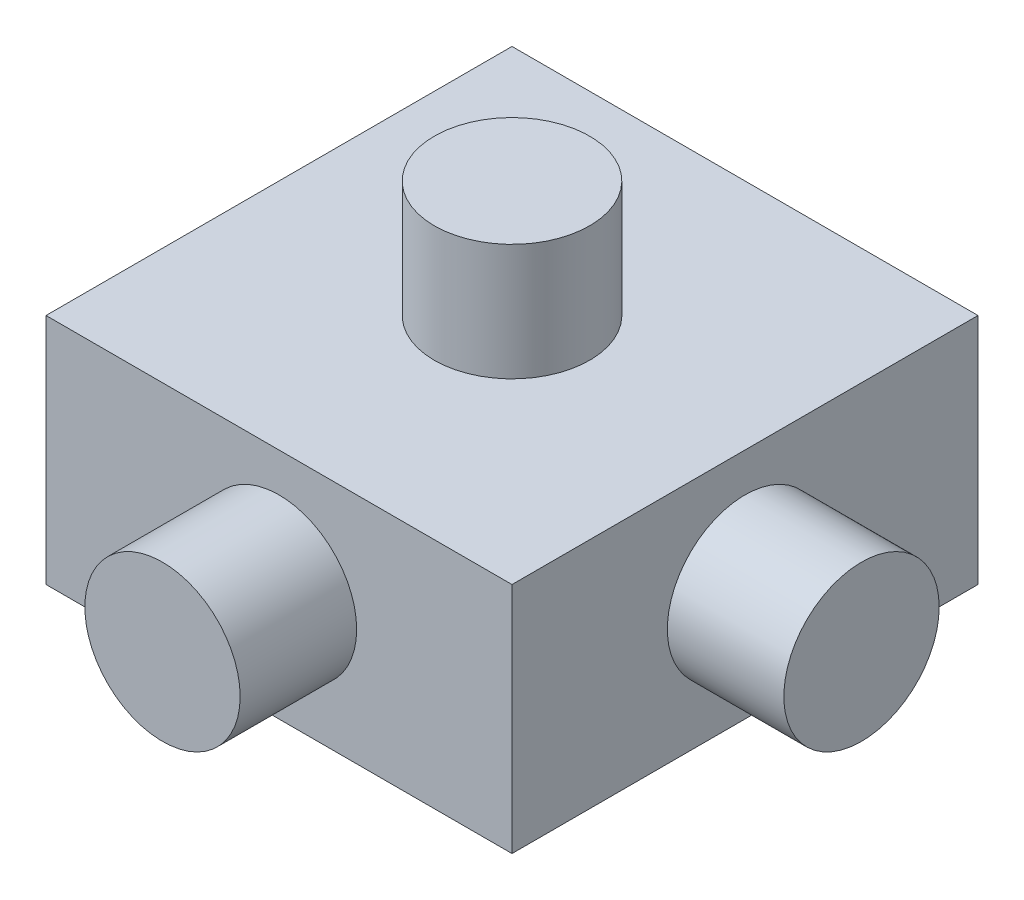
ISO-10303-21;
HEADER;
FILE_DESCRIPTION(('STEP AP214'),'2;1');
FILE_NAME('part.step','',(''),(''),'','','');
FILE_SCHEMA(('AUTOMOTIVE_DESIGN { 1 0 10303 214 1 1 1 1 }'));
ENDSEC;
DATA;
#1=APPLICATION_CONTEXT('core data for automotive mechanical design processes');
#2=APPLICATION_PROTOCOL_DEFINITION('international standard','automotive_design',2000,#1);
#3=PRODUCT_CONTEXT('',#1,'mechanical');
#4=PRODUCT('Part','Part','',(#3));
#5=PRODUCT_RELATED_PRODUCT_CATEGORY('part','',(#4));
#6=PRODUCT_DEFINITION_FORMATION('','',#4);
#7=PRODUCT_DEFINITION_CONTEXT('part definition',#1,'design');
#8=PRODUCT_DEFINITION('design','',#6,#7);
#9=PRODUCT_DEFINITION_SHAPE('','',#8);
#10=(LENGTH_UNIT() NAMED_UNIT(*) SI_UNIT(.MILLI.,.METRE.));
#11=(NAMED_UNIT(*) PLANE_ANGLE_UNIT() SI_UNIT($,.RADIAN.));
#12=(NAMED_UNIT(*) SI_UNIT($,.STERADIAN.) SOLID_ANGLE_UNIT());
#13=UNCERTAINTY_MEASURE_WITH_UNIT(LENGTH_MEASURE(1.E-05),#10,'distance_accuracy_value','');
#14=(GEOMETRIC_REPRESENTATION_CONTEXT(3) GLOBAL_UNCERTAINTY_ASSIGNED_CONTEXT((#13)) GLOBAL_UNIT_ASSIGNED_CONTEXT((#10,
#11,#12)) REPRESENTATION_CONTEXT('',''));
#15=CARTESIAN_POINT('',(0.,0.,0.));
#16=DIRECTION('',(0.,0.,1.));
#17=DIRECTION('',(1.,0.,0.));
#18=AXIS2_PLACEMENT_3D('',#15,#16,#17);
#19=CARTESIAN_POINT('',(-42.687876758205,30.,27.3673811118553));
#20=DIRECTION('',(1.,0.,0.));
#21=DIRECTION('',(0.,0.,-1.));
#22=AXIS2_PLACEMENT_3D('',#19,#20,#21);
#23=PLANE('',#22);
#24=DIRECTION('',(0.,0.,1.));
#25=VECTOR('',#24,1.);
#26=CARTESIAN_POINT('',(-42.687876758205,0.,27.3673811118553));
#27=LINE('',#26,#25);
#28=CARTESIAN_POINT('',(-42.687876758205,0.,-32.6326188881447));
#29=VERTEX_POINT('',#28);
#30=CARTESIAN_POINT('',(-42.687876758205,0.,27.3673811118553));
#31=VERTEX_POINT('',#30);
#32=EDGE_CURVE('E100',#29,#31,#27,.T.);
#33=ORIENTED_EDGE('',*,*,#32,.T.);
#34=DIRECTION('',(0.,-1.,0.));
#35=VECTOR('',#34,1.);
#36=CARTESIAN_POINT('',(-42.687876758205,30.,27.3673811118553));
#37=LINE('',#36,#35);
#38=CARTESIAN_POINT('',(-42.687876758205,30.,27.3673811118553));
#39=VERTEX_POINT('',#38);
#40=EDGE_CURVE('E36',#39,#31,#37,.T.);
#41=ORIENTED_EDGE('',*,*,#40,.F.);
#42=DIRECTION('',(0.,0.,1.));
#43=VECTOR('',#42,1.);
#44=CARTESIAN_POINT('',(-42.687876758205,30.,27.3673811118553));
#45=LINE('',#44,#43);
#46=CARTESIAN_POINT('',(-42.687876758205,30.,-32.6326188881447));
#47=VERTEX_POINT('',#46);
#48=EDGE_CURVE('E87',#47,#39,#45,.T.);
#49=ORIENTED_EDGE('',*,*,#48,.F.);
#50=DIRECTION('',(0.,-1.,0.));
#51=VECTOR('',#50,1.);
#52=CARTESIAN_POINT('',(-42.687876758205,30.,-32.6326188881447));
#53=LINE('',#52,#51);
#54=EDGE_CURVE('E96',#47,#29,#53,.T.);
#55=ORIENTED_EDGE('',*,*,#54,.T.);
#56=EDGE_LOOP('',(#33,#41,#49,#55));
#57=FACE_BOUND('',#56,.T.);
#58=ADVANCED_FACE('F33',(#57),#23,.F.);
#59=CARTESIAN_POINT('',(-42.687876758205,30.,27.3673811118553));
#60=DIRECTION('',(0.,0.,-1.));
#61=DIRECTION('',(-1.,0.,0.));
#62=AXIS2_PLACEMENT_3D('',#59,#60,#61);
#63=PLANE('',#62);
#64=CARTESIAN_POINT('',(-12.687876758205,15.,27.3673811118553));
#65=DIRECTION('',(0.,0.,1.));
#66=DIRECTION('',(1.,0.,0.));
#67=AXIS2_PLACEMENT_3D('',#64,#65,#66);
#68=CIRCLE('',#67,10.);
#69=CARTESIAN_POINT('',(-2.68787675820496,15.,27.3673811118553));
#70=VERTEX_POINT('',#69);
#71=EDGE_CURVE('E42',#70,#70,#68,.T.);
#72=ORIENTED_EDGE('',*,*,#71,.F.);
#73=EDGE_LOOP('',(#72));
#74=FACE_BOUND('',#73,.T.);
#75=DIRECTION('',(1.,0.,0.));
#76=VECTOR('',#75,1.);
#77=CARTESIAN_POINT('',(-42.687876758205,0.,27.3673811118553));
#78=LINE('',#77,#76);
#79=CARTESIAN_POINT('',(17.312123241795,0.,27.3673811118553));
#80=VERTEX_POINT('',#79);
#81=EDGE_CURVE('E92',#31,#80,#78,.T.);
#82=ORIENTED_EDGE('',*,*,#81,.T.);
#83=DIRECTION('',(0.,-1.,0.));
#84=VECTOR('',#83,1.);
#85=CARTESIAN_POINT('',(17.312123241795,30.,27.3673811118553));
#86=LINE('',#85,#84);
#87=CARTESIAN_POINT('',(17.312123241795,30.,27.3673811118553));
#88=VERTEX_POINT('',#87);
#89=EDGE_CURVE('E90',#88,#80,#86,.T.);
#90=ORIENTED_EDGE('',*,*,#89,.F.);
#91=DIRECTION('',(1.,0.,0.));
#92=VECTOR('',#91,1.);
#93=CARTESIAN_POINT('',(-42.687876758205,30.,27.3673811118553));
#94=LINE('',#93,#92);
#95=EDGE_CURVE('E82',#39,#88,#94,.T.);
#96=ORIENTED_EDGE('',*,*,#95,.F.);
#97=ORIENTED_EDGE('',*,*,#40,.T.);
#98=EDGE_LOOP('',(#82,#90,#96,#97));
#99=FACE_BOUND('',#98,.T.);
#100=ADVANCED_FACE('F91',(#74,#99),#63,.F.);
#101=CARTESIAN_POINT('',(17.312123241795,30.,27.3673811118553));
#102=DIRECTION('',(-1.,0.,0.));
#103=DIRECTION('',(0.,0.,1.));
#104=AXIS2_PLACEMENT_3D('',#101,#102,#103);
#105=PLANE('',#104);
#106=CARTESIAN_POINT('',(17.312123241795,15.,-2.63261888814467));
#107=DIRECTION('',(1.,0.,0.));
#108=DIRECTION('',(0.,0.,-1.));
#109=AXIS2_PLACEMENT_3D('',#106,#107,#108);
#110=CIRCLE('',#109,10.);
#111=CARTESIAN_POINT('',(17.312123241795,15.,-12.6326188881447));
#112=VERTEX_POINT('',#111);
#113=EDGE_CURVE('E114',#112,#112,#110,.T.);
#114=ORIENTED_EDGE('',*,*,#113,.F.);
#115=EDGE_LOOP('',(#114));
#116=FACE_BOUND('',#115,.T.);
#117=DIRECTION('',(0.,0.,-1.));
#118=VECTOR('',#117,1.);
#119=CARTESIAN_POINT('',(17.312123241795,0.,27.3673811118553));
#120=LINE('',#119,#118);
#121=CARTESIAN_POINT('',(17.312123241795,0.,-32.6326188881447));
#122=VERTEX_POINT('',#121);
#123=EDGE_CURVE('E68',#80,#122,#120,.T.);
#124=ORIENTED_EDGE('',*,*,#123,.T.);
#125=DIRECTION('',(0.,-1.,0.));
#126=VECTOR('',#125,1.);
#127=CARTESIAN_POINT('',(17.312123241795,30.,-32.6326188881447));
#128=LINE('',#127,#126);
#129=CARTESIAN_POINT('',(17.312123241795,30.,-32.6326188881447));
#130=VERTEX_POINT('',#129);
#131=EDGE_CURVE('E93',#130,#122,#128,.T.);
#132=ORIENTED_EDGE('',*,*,#131,.F.);
#133=DIRECTION('',(0.,0.,-1.));
#134=VECTOR('',#133,1.);
#135=CARTESIAN_POINT('',(17.312123241795,30.,27.3673811118553));
#136=LINE('',#135,#134);
#137=EDGE_CURVE('E85',#88,#130,#136,.T.);
#138=ORIENTED_EDGE('',*,*,#137,.F.);
#139=ORIENTED_EDGE('',*,*,#89,.T.);
#140=EDGE_LOOP('',(#124,#132,#138,#139));
#141=FACE_BOUND('',#140,.T.);
#142=ADVANCED_FACE('F94',(#116,#141),#105,.F.);
#143=CARTESIAN_POINT('',(-42.687876758205,30.,-32.6326188881447));
#144=DIRECTION('',(0.,0.,1.));
#145=DIRECTION('',(1.,0.,0.));
#146=AXIS2_PLACEMENT_3D('',#143,#144,#145);
#147=PLANE('',#146);
#148=DIRECTION('',(-1.,0.,0.));
#149=VECTOR('',#148,1.);
#150=CARTESIAN_POINT('',(-42.687876758205,0.,-32.6326188881447));
#151=LINE('',#150,#149);
#152=EDGE_CURVE('E74',#122,#29,#151,.T.);
#153=ORIENTED_EDGE('',*,*,#152,.T.);
#154=ORIENTED_EDGE('',*,*,#54,.F.);
#155=DIRECTION('',(-1.,0.,0.));
#156=VECTOR('',#155,1.);
#157=CARTESIAN_POINT('',(-42.687876758205,30.,-32.6326188881447));
#158=LINE('',#157,#156);
#159=EDGE_CURVE('E51',#130,#47,#158,.T.);
#160=ORIENTED_EDGE('',*,*,#159,.F.);
#161=ORIENTED_EDGE('',*,*,#131,.T.);
#162=EDGE_LOOP('',(#153,#154,#160,#161));
#163=FACE_BOUND('',#162,.T.);
#164=ADVANCED_FACE('F108',(#163),#147,.F.);
#165=CARTESIAN_POINT('',(0.,30.,0.));
#166=DIRECTION('',(0.,-1.,0.));
#167=DIRECTION('',(0.,0.,-1.));
#168=AXIS2_PLACEMENT_3D('',#165,#166,#167);
#169=PLANE('',#168);
#170=CARTESIAN_POINT('',(-12.687876758205,30.,-2.63261888814467));
#171=DIRECTION('',(0.,1.,0.));
#172=DIRECTION('',(0.,0.,1.));
#173=AXIS2_PLACEMENT_3D('',#170,#171,#172);
#174=CIRCLE('',#173,10.);
#175=CARTESIAN_POINT('',(-12.687876758205,30.,7.36738111185533));
#176=VERTEX_POINT('',#175);
#177=EDGE_CURVE('E11',#176,#176,#174,.T.);
#178=ORIENTED_EDGE('',*,*,#177,.F.);
#179=EDGE_LOOP('',(#178));
#180=FACE_BOUND('',#179,.T.);
#181=ORIENTED_EDGE('',*,*,#48,.T.);
#182=ORIENTED_EDGE('',*,*,#95,.T.);
#183=ORIENTED_EDGE('',*,*,#137,.T.);
#184=ORIENTED_EDGE('',*,*,#159,.T.);
#185=EDGE_LOOP('',(#181,#182,#183,#184));
#186=FACE_BOUND('',#185,.T.);
#187=ADVANCED_FACE('F83',(#180,#186),#169,.F.);
#188=CARTESIAN_POINT('',(0.,0.,0.));
#189=DIRECTION('',(0.,-1.,0.));
#190=DIRECTION('',(0.,0.,-1.));
#191=AXIS2_PLACEMENT_3D('',#188,#189,#190);
#192=PLANE('',#191);
#193=ORIENTED_EDGE('',*,*,#32,.F.);
#194=ORIENTED_EDGE('',*,*,#152,.F.);
#195=ORIENTED_EDGE('',*,*,#123,.F.);
#196=ORIENTED_EDGE('',*,*,#81,.F.);
#197=EDGE_LOOP('',(#193,#194,#195,#196));
#198=FACE_BOUND('',#197,.T.);
#199=ADVANCED_FACE('F111',(#198),#192,.T.);
#200=CARTESIAN_POINT('',(32.312123241795,15.,-2.63261888814467));
#201=DIRECTION('',(-1.,0.,0.));
#202=DIRECTION('',(0.,0.,1.));
#203=AXIS2_PLACEMENT_3D('',#200,#201,#202);
#204=CYLINDRICAL_SURFACE('',#203,10.);
#205=CARTESIAN_POINT('',(32.312123241795,15.,-2.63261888814467));
#206=DIRECTION('',(1.,0.,0.));
#207=DIRECTION('',(0.,0.,-1.));
#208=AXIS2_PLACEMENT_3D('',#205,#206,#207);
#209=CIRCLE('',#208,10.);
#210=CARTESIAN_POINT('',(32.312123241795,15.,-12.6326188881447));
#211=VERTEX_POINT('',#210);
#212=EDGE_CURVE('E103',#211,#211,#209,.T.);
#213=ORIENTED_EDGE('',*,*,#212,.F.);
#214=EDGE_LOOP('',(#213));
#215=FACE_BOUND('',#214,.T.);
#216=ORIENTED_EDGE('',*,*,#113,.T.);
#217=EDGE_LOOP('',(#216));
#218=FACE_BOUND('',#217,.T.);
#219=ADVANCED_FACE('F143',(#215,#218),#204,.T.);
#220=CARTESIAN_POINT('',(32.312123241795,15.,-2.63261888814467));
#221=DIRECTION('',(1.,0.,0.));
#222=DIRECTION('',(0.,0.,-1.));
#223=AXIS2_PLACEMENT_3D('',#220,#221,#222);
#224=PLANE('',#223);
#225=ORIENTED_EDGE('',*,*,#212,.T.);
#226=EDGE_LOOP('',(#225));
#227=FACE_BOUND('',#226,.T.);
#228=ADVANCED_FACE('F161',(#227),#224,.T.);
#229=CARTESIAN_POINT('',(-12.687876758205,15.,42.3673811118553));
#230=DIRECTION('',(0.,0.,-1.));
#231=DIRECTION('',(-1.,0.,0.));
#232=AXIS2_PLACEMENT_3D('',#229,#230,#231);
#233=CYLINDRICAL_SURFACE('',#232,10.);
#234=CARTESIAN_POINT('',(-12.687876758205,15.,42.3673811118553));
#235=DIRECTION('',(0.,0.,1.));
#236=DIRECTION('',(1.,0.,0.));
#237=AXIS2_PLACEMENT_3D('',#234,#235,#236);
#238=CIRCLE('',#237,10.);
#239=CARTESIAN_POINT('',(-2.68787675820496,15.,42.3673811118553));
#240=VERTEX_POINT('',#239);
#241=EDGE_CURVE('E119',#240,#240,#238,.T.);
#242=ORIENTED_EDGE('',*,*,#241,.F.);
#243=EDGE_LOOP('',(#242));
#244=FACE_BOUND('',#243,.T.);
#245=ORIENTED_EDGE('',*,*,#71,.T.);
#246=EDGE_LOOP('',(#245));
#247=FACE_BOUND('',#246,.T.);
#248=ADVANCED_FACE('F159',(#244,#247),#233,.T.);
#249=CARTESIAN_POINT('',(-12.687876758205,15.,42.3673811118553));
#250=DIRECTION('',(0.,0.,1.));
#251=DIRECTION('',(1.,0.,0.));
#252=AXIS2_PLACEMENT_3D('',#249,#250,#251);
#253=PLANE('',#252);
#254=ORIENTED_EDGE('',*,*,#241,.T.);
#255=EDGE_LOOP('',(#254));
#256=FACE_BOUND('',#255,.T.);
#257=ADVANCED_FACE('F133',(#256),#253,.T.);
#258=CARTESIAN_POINT('',(-12.687876758205,45.,-2.63261888814467));
#259=DIRECTION('',(0.,-1.,0.));
#260=DIRECTION('',(0.,0.,-1.));
#261=AXIS2_PLACEMENT_3D('',#258,#259,#260);
#262=CYLINDRICAL_SURFACE('',#261,10.);
#263=CARTESIAN_POINT('',(-12.687876758205,45.,-2.63261888814467));
#264=DIRECTION('',(0.,1.,0.));
#265=DIRECTION('',(0.,0.,1.));
#266=AXIS2_PLACEMENT_3D('',#263,#264,#265);
#267=CIRCLE('',#266,10.);
#268=CARTESIAN_POINT('',(-12.687876758205,45.,7.36738111185533));
#269=VERTEX_POINT('',#268);
#270=EDGE_CURVE('E123',#269,#269,#267,.T.);
#271=ORIENTED_EDGE('',*,*,#270,.F.);
#272=EDGE_LOOP('',(#271));
#273=FACE_BOUND('',#272,.T.);
#274=ORIENTED_EDGE('',*,*,#177,.T.);
#275=EDGE_LOOP('',(#274));
#276=FACE_BOUND('',#275,.T.);
#277=ADVANCED_FACE('F130',(#273,#276),#262,.T.);
#278=CARTESIAN_POINT('',(-12.687876758205,45.,-2.63261888814467));
#279=DIRECTION('',(0.,1.,0.));
#280=DIRECTION('',(0.,0.,1.));
#281=AXIS2_PLACEMENT_3D('',#278,#279,#280);
#282=PLANE('',#281);
#283=ORIENTED_EDGE('',*,*,#270,.T.);
#284=EDGE_LOOP('',(#283));
#285=FACE_BOUND('',#284,.T.);
#286=ADVANCED_FACE('F128',(#285),#282,.T.);
#287=CLOSED_SHELL('',(#58,#100,#142,#164,#187,#199,#219,#228,#248,#257,#277,#286));
#288=MANIFOLD_SOLID_BREP('B2',#287);
#289=ADVANCED_BREP_SHAPE_REPRESENTATION('',(#18,#288),#14);
#290=SHAPE_DEFINITION_REPRESENTATION(#9,#289);
ENDSEC;
END-ISO-10303-21;
